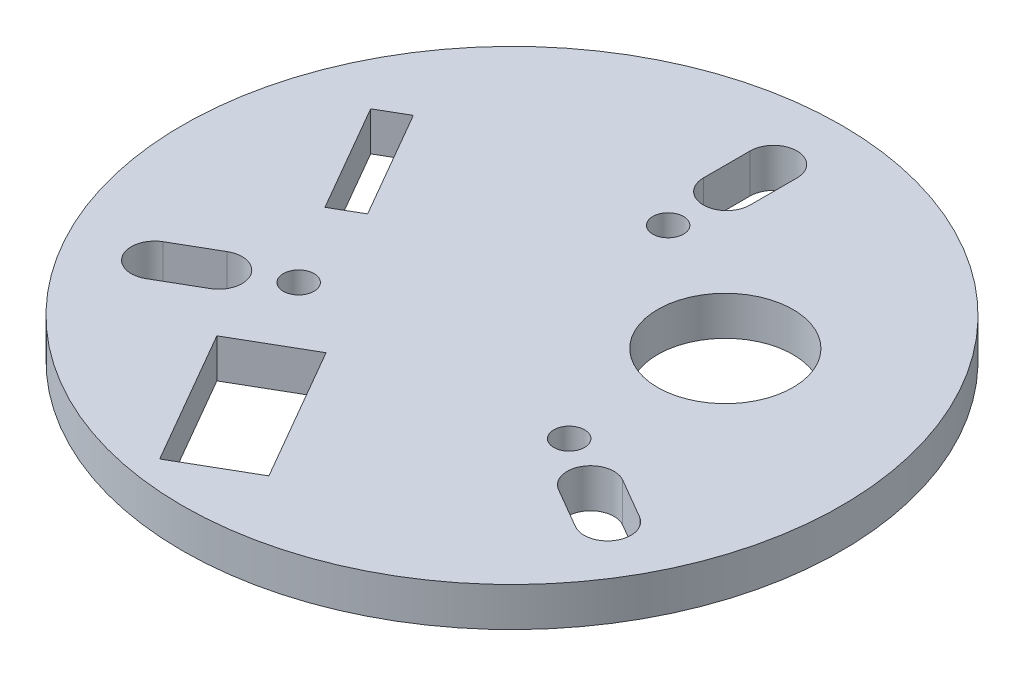
ISO-10303-21;
HEADER;
FILE_DESCRIPTION(('STEP AP214'),'2;1');
FILE_NAME('part.step','',(''),(''),'','','');
FILE_SCHEMA(('AUTOMOTIVE_DESIGN { 1 0 10303 214 1 1 1 1 }'));
ENDSEC;
DATA;
#1=APPLICATION_CONTEXT('core data for automotive mechanical design processes');
#2=APPLICATION_PROTOCOL_DEFINITION('international standard','automotive_design',2000,#1);
#3=PRODUCT_CONTEXT('',#1,'mechanical');
#4=PRODUCT('Part','Part','',(#3));
#5=PRODUCT_RELATED_PRODUCT_CATEGORY('part','',(#4));
#6=PRODUCT_DEFINITION_FORMATION('','',#4);
#7=PRODUCT_DEFINITION_CONTEXT('part definition',#1,'design');
#8=PRODUCT_DEFINITION('design','',#6,#7);
#9=PRODUCT_DEFINITION_SHAPE('','',#8);
#10=(LENGTH_UNIT() NAMED_UNIT(*) SI_UNIT(.MILLI.,.METRE.));
#11=(NAMED_UNIT(*) PLANE_ANGLE_UNIT() SI_UNIT($,.RADIAN.));
#12=(NAMED_UNIT(*) SI_UNIT($,.STERADIAN.) SOLID_ANGLE_UNIT());
#13=UNCERTAINTY_MEASURE_WITH_UNIT(LENGTH_MEASURE(1.E-05),#10,'distance_accuracy_value','');
#14=(GEOMETRIC_REPRESENTATION_CONTEXT(3) GLOBAL_UNCERTAINTY_ASSIGNED_CONTEXT((#13)) GLOBAL_UNIT_ASSIGNED_CONTEXT((#10,
#11,#12)) REPRESENTATION_CONTEXT('',''));
#15=CARTESIAN_POINT('',(0.,0.,0.));
#16=DIRECTION('',(0.,0.,1.));
#17=DIRECTION('',(1.,0.,0.));
#18=AXIS2_PLACEMENT_3D('',#15,#16,#17);
#19=CARTESIAN_POINT('',(0.,3.175,0.));
#20=DIRECTION('',(0.,1.,0.));
#21=DIRECTION('',(0.,0.,1.));
#22=AXIS2_PLACEMENT_3D('',#19,#20,#21);
#23=PLANE('',#22);
#24=DIRECTION('',(0.499999999999997,0.,0.86602540378444));
#25=VECTOR('',#24,1.);
#26=CARTESIAN_POINT('',(-15.2220670788775,3.175,-0.0103535768375322));
#27=LINE('',#26,#25);
#28=CARTESIAN_POINT('',(-20.3020670788775,3.175,-8.80917167928746));
#29=VERTEX_POINT('',#28);
#30=CARTESIAN_POINT('',(-15.2220670788775,3.175,-0.010353576837532));
#31=VERTEX_POINT('',#30);
#32=EDGE_CURVE('E51',#29,#31,#27,.T.);
#33=ORIENTED_EDGE('',*,*,#32,.F.);
#34=DIRECTION('',(-0.86602540378444,0.,0.499999999999997));
#35=VECTOR('',#34,1.);
#36=CARTESIAN_POINT('',(-20.3020670788775,3.175,-8.80917167928746));
#37=LINE('',#36,#35);
#38=CARTESIAN_POINT('',(-18.102362553265,3.175,-10.0791716792874));
#39=VERTEX_POINT('',#38);
#40=EDGE_CURVE('E191',#39,#29,#37,.T.);
#41=ORIENTED_EDGE('',*,*,#40,.F.);
#42=DIRECTION('',(-0.499999999999997,0.,-0.86602540378444));
#43=VECTOR('',#42,1.);
#44=CARTESIAN_POINT('',(-13.0223625532649,3.175,-1.28035357683724));
#45=LINE('',#44,#43);
#46=CARTESIAN_POINT('',(-13.0223625532649,3.175,-1.28035357683724));
#47=VERTEX_POINT('',#46);
#48=EDGE_CURVE('E176',#47,#39,#45,.T.);
#49=ORIENTED_EDGE('',*,*,#48,.F.);
#50=DIRECTION('',(0.866025403784505,0.,-0.499999999999885));
#51=VECTOR('',#50,1.);
#52=CARTESIAN_POINT('',(-15.2220670788775,3.175,-0.0103535768375322));
#53=LINE('',#52,#51);
#54=EDGE_CURVE('E185',#31,#47,#53,.T.);
#55=ORIENTED_EDGE('',*,*,#54,.F.);
#56=EDGE_LOOP('',(#33,#41,#49,#55));
#57=FACE_BOUND('',#56,.T.);
#58=DIRECTION('',(0.499999999999986,0.,0.866025403784447));
#59=VECTOR('',#58,1.);
#60=CARTESIAN_POINT('',(-4.21667541505758,3.175,24.4315439420934));
#61=LINE('',#60,#59);
#62=CARTESIAN_POINT('',(-10.5666754150574,3.175,13.4330213140309));
#63=VERTEX_POINT('',#62);
#64=CARTESIAN_POINT('',(-4.21667541505758,3.175,24.4315439420934));
#65=VERTEX_POINT('',#64);
#66=EDGE_CURVE('E198',#63,#65,#61,.T.);
#67=ORIENTED_EDGE('',*,*,#66,.F.);
#68=DIRECTION('',(-0.86602540378444,0.,0.499999999999997));
#69=VECTOR('',#68,1.);
#70=CARTESIAN_POINT('',(-10.5666754150574,3.175,13.4330213140309));
#71=LINE('',#70,#69);
#72=CARTESIAN_POINT('',(-4.93751029045854,3.175,10.1830213140309));
#73=VERTEX_POINT('',#72);
#74=EDGE_CURVE('E208',#73,#63,#71,.T.);
#75=ORIENTED_EDGE('',*,*,#74,.F.);
#76=DIRECTION('',(-0.499999999999998,0.,-0.86602540378444));
#77=VECTOR('',#76,1.);
#78=CARTESIAN_POINT('',(1.41248970954142,3.175,21.1815439420933));
#79=LINE('',#78,#77);
#80=CARTESIAN_POINT('',(1.41248970954142,3.175,21.1815439420933));
#81=VERTEX_POINT('',#80);
#82=EDGE_CURVE('E205',#81,#73,#79,.T.);
#83=ORIENTED_EDGE('',*,*,#82,.F.);
#84=DIRECTION('',(0.866025403784439,0.,-0.499999999999999));
#85=VECTOR('',#84,1.);
#86=CARTESIAN_POINT('',(-4.21667541505758,3.175,24.4315439420934));
#87=LINE('',#86,#85);
#88=EDGE_CURVE('E202',#65,#81,#87,.T.);
#89=ORIENTED_EDGE('',*,*,#88,.F.);
#90=EDGE_LOOP('',(#67,#75,#83,#89));
#91=FACE_BOUND('',#90,.T.);
#92=CARTESIAN_POINT('',(10.9985226280623,3.175,-6.35000000000005));
#93=DIRECTION('',(0.,1.,0.));
#94=DIRECTION('',(0.,0.,1.));
#95=AXIS2_PLACEMENT_3D('',#92,#93,#94);
#96=CIRCLE('',#95,5.5);
#97=CARTESIAN_POINT('',(10.9985226280623,3.175,-0.850000000000054));
#98=VERTEX_POINT('',#97);
#99=EDGE_CURVE('E214',#98,#98,#96,.T.);
#100=ORIENTED_EDGE('',*,*,#99,.F.);
#101=EDGE_LOOP('',(#100));
#102=FACE_BOUND('',#101,.T.);
#103=CARTESIAN_POINT('',(10.9985226280623,3.175,6.35000000000005));
#104=DIRECTION('',(0.,1.,0.));
#105=DIRECTION('',(0.,0.,1.));
#106=AXIS2_PLACEMENT_3D('',#103,#104,#105);
#107=CIRCLE('',#106,1.25);
#108=CARTESIAN_POINT('',(10.9985226280623,3.175,7.60000000000005));
#109=VERTEX_POINT('',#108);
#110=EDGE_CURVE('E228',#109,#109,#107,.T.);
#111=ORIENTED_EDGE('',*,*,#110,.F.);
#112=EDGE_LOOP('',(#111));
#113=FACE_BOUND('',#112,.T.);
#114=CARTESIAN_POINT('',(0.,3.175,-12.7));
#115=DIRECTION('',(0.,1.,0.));
#116=DIRECTION('',(0.,0.,1.));
#117=AXIS2_PLACEMENT_3D('',#114,#115,#116);
#118=CIRCLE('',#117,1.25);
#119=CARTESIAN_POINT('',(0.,3.175,-11.45));
#120=VERTEX_POINT('',#119);
#121=EDGE_CURVE('E227',#120,#120,#118,.T.);
#122=ORIENTED_EDGE('',*,*,#121,.F.);
#123=EDGE_LOOP('',(#122));
#124=FACE_BOUND('',#123,.T.);
#125=CARTESIAN_POINT('',(-10.9985226280624,3.175,6.3499999999999));
#126=DIRECTION('',(0.,1.,0.));
#127=DIRECTION('',(0.,0.,1.));
#128=AXIS2_PLACEMENT_3D('',#125,#126,#127);
#129=CIRCLE('',#128,1.25);
#130=CARTESIAN_POINT('',(-10.9985226280624,3.175,7.5999999999999));
#131=VERTEX_POINT('',#130);
#132=EDGE_CURVE('E234',#131,#131,#129,.T.);
#133=ORIENTED_EDGE('',*,*,#132,.F.);
#134=EDGE_LOOP('',(#133));
#135=FACE_BOUND('',#134,.T.);
#136=CARTESIAN_POINT('',(15.1230582521105,3.175,8.73128949130568));
#137=DIRECTION('',(0.,1.,0.));
#138=DIRECTION('',(0.,0.,1.));
#139=AXIS2_PLACEMENT_3D('',#136,#137,#138);
#140=CIRCLE('',#139,1.905);
#141=CARTESIAN_POINT('',(14.1650551040501,3.175,10.3778783799802));
#142=VERTEX_POINT('',#141);
#143=CARTESIAN_POINT('',(16.0810614001708,3.175,7.08470060263115));
#144=VERTEX_POINT('',#143);
#145=EDGE_CURVE('E289',#142,#144,#140,.F.);
#146=ORIENTED_EDGE('',*,*,#145,.T.);
#147=DIRECTION('',(0.864351122663791,0.,0.502888791632746));
#148=VECTOR('',#147,1.);
#149=CARTESIAN_POINT('',(0.987329920654388,3.175,-1.69699492125567));
#150=LINE('',#149,#148);
#151=CARTESIAN_POINT('',(19.3742391775199,3.175,9.00070689875192));
#152=VERTEX_POINT('',#151);
#153=EDGE_CURVE('E268',#144,#152,#150,.T.);
#154=ORIENTED_EDGE('',*,*,#153,.T.);
#155=CARTESIAN_POINT('',(18.4162360294595,3.175,10.6472957874264));
#156=DIRECTION('',(0.,1.,0.));
#157=DIRECTION('',(0.,0.,1.));
#158=AXIS2_PLACEMENT_3D('',#155,#156,#157);
#159=CIRCLE('',#158,1.905);
#160=CARTESIAN_POINT('',(17.4582328813991,3.175,12.293884676101));
#161=VERTEX_POINT('',#160);
#162=EDGE_CURVE('E278',#161,#152,#159,.T.);
#163=ORIENTED_EDGE('',*,*,#162,.F.);
#164=DIRECTION('',(0.864351122663792,0.,0.502888791632745));
#165=VECTOR('',#164,1.);
#166=CARTESIAN_POINT('',(-0.928676375466387,3.175,1.5961828560934));
#167=LINE('',#166,#165);
#168=EDGE_CURVE('E292',#142,#161,#167,.T.);
#169=ORIENTED_EDGE('',*,*,#168,.F.);
#170=EDGE_LOOP('',(#146,#154,#163,#169));
#171=FACE_BOUND('',#170,.T.);
#172=CARTESIAN_POINT('',(-4.99999999994862E-05,3.175,-21.2725));
#173=DIRECTION('',(0.,1.,0.));
#174=DIRECTION('',(0.,0.,1.));
#175=AXIS2_PLACEMENT_3D('',#172,#173,#174);
#176=CIRCLE('',#175,1.905);
#177=CARTESIAN_POINT('',(-1.90505,3.175,-21.2725));
#178=VERTEX_POINT('',#177);
#179=CARTESIAN_POINT('',(1.90495,3.175,-21.2725));
#180=VERTEX_POINT('',#179);
#181=EDGE_CURVE('E320',#178,#180,#176,.F.);
#182=ORIENTED_EDGE('',*,*,#181,.T.);
#183=DIRECTION('',(0.,0.,1.));
#184=VECTOR('',#183,1.);
#185=CARTESIAN_POINT('',(1.90495,3.175,0.));
#186=LINE('',#185,#184);
#187=CARTESIAN_POINT('',(1.90495,3.175,-17.4625));
#188=VERTEX_POINT('',#187);
#189=EDGE_CURVE('E299',#180,#188,#186,.T.);
#190=ORIENTED_EDGE('',*,*,#189,.T.);
#191=CARTESIAN_POINT('',(-4.99999999993778E-05,3.175,-17.4625));
#192=DIRECTION('',(0.,1.,0.));
#193=DIRECTION('',(0.,0.,1.));
#194=AXIS2_PLACEMENT_3D('',#191,#192,#193);
#195=CIRCLE('',#194,1.905);
#196=CARTESIAN_POINT('',(-1.90505,3.175,-17.4625));
#197=VERTEX_POINT('',#196);
#198=EDGE_CURVE('E309',#197,#188,#195,.T.);
#199=ORIENTED_EDGE('',*,*,#198,.F.);
#200=DIRECTION('',(0.,0.,1.));
#201=VECTOR('',#200,1.);
#202=CARTESIAN_POINT('',(-1.90505,3.175,0.));
#203=LINE('',#202,#201);
#204=EDGE_CURVE('E323',#178,#197,#203,.T.);
#205=ORIENTED_EDGE('',*,*,#204,.F.);
#206=EDGE_LOOP('',(#182,#190,#199,#205));
#207=FACE_BOUND('',#206,.T.);
#208=CARTESIAN_POINT('',(0.,3.175,0.));
#209=DIRECTION('',(0.,1.,0.));
#210=DIRECTION('',(0.,0.,1.));
#211=AXIS2_PLACEMENT_3D('',#208,#209,#210);
#212=CIRCLE('',#211,26.799999994);
#213=CARTESIAN_POINT('',(0.,3.175,26.799999994));
#214=VERTEX_POINT('',#213);
#215=EDGE_CURVE('E337',#214,#214,#212,.T.);
#216=ORIENTED_EDGE('',*,*,#215,.T.);
#217=EDGE_LOOP('',(#216));
#218=FACE_BOUND('',#217,.T.);
#219=CARTESIAN_POINT('',(-15.1229051135858,3.175,8.73135998522614));
#220=DIRECTION('',(0.,1.,0.));
#221=DIRECTION('',(0.,0.,1.));
#222=AXIS2_PLACEMENT_3D('',#219,#220,#221);
#223=CIRCLE('',#222,1.905);
#224=CARTESIAN_POINT('',(-14.1704051135859,3.175,10.3811383794355));
#225=VERTEX_POINT('',#224);
#226=CARTESIAN_POINT('',(-16.0754051135858,3.175,7.08158159101678));
#227=VERTEX_POINT('',#226);
#228=EDGE_CURVE('E258',#225,#227,#223,.T.);
#229=ORIENTED_EDGE('',*,*,#228,.F.);
#230=DIRECTION('',(-0.866025403784443,0.,0.499999999999992));
#231=VECTOR('',#230,1.);
#232=CARTESIAN_POINT('',(0.952563499999987,3.175,1.64988837943565));
#233=LINE('',#232,#231);
#234=CARTESIAN_POINT('',(-17.4699619020046,3.175,12.2861383794355));
#235=VERTEX_POINT('',#234);
#236=EDGE_CURVE('E240',#225,#235,#233,.T.);
#237=ORIENTED_EDGE('',*,*,#236,.T.);
#238=CARTESIAN_POINT('',(-18.4224619020046,3.175,10.6363599852261));
#239=DIRECTION('',(0.,1.,0.));
#240=DIRECTION('',(0.,0.,1.));
#241=AXIS2_PLACEMENT_3D('',#238,#239,#240);
#242=CIRCLE('',#241,1.905);
#243=CARTESIAN_POINT('',(-19.3749619020046,3.175,8.98658159101675));
#244=VERTEX_POINT('',#243);
#245=EDGE_CURVE('E246',#244,#235,#242,.T.);
#246=ORIENTED_EDGE('',*,*,#245,.F.);
#247=DIRECTION('',(-0.866025403784443,0.,0.499999999999992));
#248=VECTOR('',#247,1.);
#249=CARTESIAN_POINT('',(-0.952436499999989,3.175,-1.64966840898309));
#250=LINE('',#249,#248);
#251=EDGE_CURVE('E261',#227,#244,#250,.T.);
#252=ORIENTED_EDGE('',*,*,#251,.F.);
#253=EDGE_LOOP('',(#229,#237,#246,#252));
#254=FACE_BOUND('',#253,.T.);
#255=ADVANCED_FACE('F36',(#57,#91,#102,#113,#124,#135,#171,#207,#218,#254),#23,.T.);
#256=CARTESIAN_POINT('',(0.,0.,0.));
#257=DIRECTION('',(0.,1.,0.));
#258=DIRECTION('',(0.,0.,1.));
#259=AXIS2_PLACEMENT_3D('',#256,#257,#258);
#260=PLANE('',#259);
#261=DIRECTION('',(-0.866025403784441,0.,0.499999999999997));
#262=VECTOR('',#261,1.);
#263=CARTESIAN_POINT('',(-8.88999999999998,0.,-15.3979316792874));
#264=LINE('',#263,#262);
#265=CARTESIAN_POINT('',(-18.102362553265,0.,-10.0791716792874));
#266=VERTEX_POINT('',#265);
#267=CARTESIAN_POINT('',(-20.3020670788775,0.,-8.80917167928746));
#268=VERTEX_POINT('',#267);
#269=EDGE_CURVE('E44',#266,#268,#264,.T.);
#270=ORIENTED_EDGE('',*,*,#269,.T.);
#271=DIRECTION('',(0.499999999999997,0.,0.86602540378444));
#272=VECTOR('',#271,1.);
#273=CARTESIAN_POINT('',(-11.4120670788775,0.,6.58875999999995));
#274=LINE('',#273,#272);
#275=CARTESIAN_POINT('',(-15.2220670788775,0.,-0.0103535768375322));
#276=VERTEX_POINT('',#275);
#277=EDGE_CURVE('E11',#268,#276,#274,.T.);
#278=ORIENTED_EDGE('',*,*,#277,.T.);
#279=DIRECTION('',(0.866025403784505,0.,-0.499999999999885));
#280=VECTOR('',#279,1.);
#281=CARTESIAN_POINT('',(-3.8099999999983,0.,-6.5991135768365));
#282=LINE('',#281,#280);
#283=CARTESIAN_POINT('',(-13.0223625532649,0.,-1.28035357683724));
#284=VERTEX_POINT('',#283);
#285=EDGE_CURVE('E356',#276,#284,#282,.T.);
#286=ORIENTED_EDGE('',*,*,#285,.T.);
#287=DIRECTION('',(-0.499999999999997,0.,-0.866025403784441));
#288=VECTOR('',#287,1.);
#289=CARTESIAN_POINT('',(-9.21236255326506,0.,5.31875999999996));
#290=LINE('',#289,#288);
#291=EDGE_CURVE('E179',#284,#266,#290,.T.);
#292=ORIENTED_EDGE('',*,*,#291,.T.);
#293=EDGE_LOOP('',(#270,#278,#286,#292));
#294=FACE_BOUND('',#293,.T.);
#295=DIRECTION('',(-0.86602540378444,0.,0.499999999999997));
#296=VECTOR('',#295,1.);
#297=CARTESIAN_POINT('',(3.17499999999994,0.,5.49926131403112));
#298=LINE('',#297,#296);
#299=CARTESIAN_POINT('',(-4.93751029045854,0.,10.1830213140309));
#300=VERTEX_POINT('',#299);
#301=CARTESIAN_POINT('',(-10.5666754150574,0.,13.4330213140309));
#302=VERTEX_POINT('',#301);
#303=EDGE_CURVE('E350',#300,#302,#298,.T.);
#304=ORIENTED_EDGE('',*,*,#303,.T.);
#305=DIRECTION('',(0.499999999999986,0.,0.866025403784447));
#306=VECTOR('',#305,1.);
#307=CARTESIAN_POINT('',(-13.7416754150574,0.,7.93375999999954));
#308=LINE('',#307,#306);
#309=CARTESIAN_POINT('',(-4.21667541505758,0.,24.4315439420934));
#310=VERTEX_POINT('',#309);
#311=EDGE_CURVE('E353',#302,#310,#308,.T.);
#312=ORIENTED_EDGE('',*,*,#311,.T.);
#313=DIRECTION('',(0.866025403784439,0.,-0.499999999999999));
#314=VECTOR('',#313,1.);
#315=CARTESIAN_POINT('',(9.52499999999993,0.,16.4977839420935));
#316=LINE('',#315,#314);
#317=CARTESIAN_POINT('',(1.41248970954142,0.,21.1815439420933));
#318=VERTEX_POINT('',#317);
#319=EDGE_CURVE('E340',#310,#318,#316,.T.);
#320=ORIENTED_EDGE('',*,*,#319,.T.);
#321=DIRECTION('',(-0.499999999999998,0.,-0.86602540378444));
#322=VECTOR('',#321,1.);
#323=CARTESIAN_POINT('',(-8.11251029045849,0.,4.68375999999979));
#324=LINE('',#323,#322);
#325=EDGE_CURVE('E347',#318,#300,#324,.T.);
#326=ORIENTED_EDGE('',*,*,#325,.T.);
#327=EDGE_LOOP('',(#304,#312,#320,#326));
#328=FACE_BOUND('',#327,.T.);
#329=CARTESIAN_POINT('',(10.9985226280623,0.,-6.35000000000005));
#330=DIRECTION('',(0.,1.,0.));
#331=DIRECTION('',(0.,0.,1.));
#332=AXIS2_PLACEMENT_3D('',#329,#330,#331);
#333=CIRCLE('',#332,5.5);
#334=CARTESIAN_POINT('',(10.9985226280623,0.,-0.850000000000054));
#335=VERTEX_POINT('',#334);
#336=EDGE_CURVE('E223',#335,#335,#333,.T.);
#337=ORIENTED_EDGE('',*,*,#336,.T.);
#338=EDGE_LOOP('',(#337));
#339=FACE_BOUND('',#338,.T.);
#340=CARTESIAN_POINT('',(10.9985226280623,0.,6.35000000000005));
#341=DIRECTION('',(0.,1.,0.));
#342=DIRECTION('',(0.,0.,1.));
#343=AXIS2_PLACEMENT_3D('',#340,#341,#342);
#344=CIRCLE('',#343,1.25);
#345=CARTESIAN_POINT('',(10.9985226280623,0.,7.60000000000005));
#346=VERTEX_POINT('',#345);
#347=EDGE_CURVE('E224',#346,#346,#344,.T.);
#348=ORIENTED_EDGE('',*,*,#347,.T.);
#349=EDGE_LOOP('',(#348));
#350=FACE_BOUND('',#349,.T.);
#351=CARTESIAN_POINT('',(0.,0.,-12.7));
#352=DIRECTION('',(0.,1.,0.));
#353=DIRECTION('',(0.,0.,1.));
#354=AXIS2_PLACEMENT_3D('',#351,#352,#353);
#355=CIRCLE('',#354,1.25);
#356=CARTESIAN_POINT('',(0.,0.,-11.45));
#357=VERTEX_POINT('',#356);
#358=EDGE_CURVE('E231',#357,#357,#355,.T.);
#359=ORIENTED_EDGE('',*,*,#358,.T.);
#360=EDGE_LOOP('',(#359));
#361=FACE_BOUND('',#360,.T.);
#362=CARTESIAN_POINT('',(-10.9985226280624,0.,6.3499999999999));
#363=DIRECTION('',(0.,1.,0.));
#364=DIRECTION('',(0.,0.,1.));
#365=AXIS2_PLACEMENT_3D('',#362,#363,#364);
#366=CIRCLE('',#365,1.25);
#367=CARTESIAN_POINT('',(-10.9985226280624,0.,7.5999999999999));
#368=VERTEX_POINT('',#367);
#369=EDGE_CURVE('E237',#368,#368,#366,.T.);
#370=ORIENTED_EDGE('',*,*,#369,.T.);
#371=EDGE_LOOP('',(#370));
#372=FACE_BOUND('',#371,.T.);
#373=CARTESIAN_POINT('',(0.,0.,0.));
#374=DIRECTION('',(0.,1.,0.));
#375=DIRECTION('',(0.,0.,1.));
#376=AXIS2_PLACEMENT_3D('',#373,#374,#375);
#377=CIRCLE('',#376,26.799999994);
#378=CARTESIAN_POINT('',(0.,0.,26.799999994));
#379=VERTEX_POINT('',#378);
#380=EDGE_CURVE('E330',#379,#379,#377,.T.);
#381=ORIENTED_EDGE('',*,*,#380,.F.);
#382=EDGE_LOOP('',(#381));
#383=FACE_BOUND('',#382,.T.);
#384=DIRECTION('',(0.,0.,1.));
#385=VECTOR('',#384,1.);
#386=CARTESIAN_POINT('',(1.90495,0.,0.));
#387=LINE('',#386,#385);
#388=CARTESIAN_POINT('',(1.90495,0.,-21.2725));
#389=VERTEX_POINT('',#388);
#390=CARTESIAN_POINT('',(1.90495,0.,-17.4625));
#391=VERTEX_POINT('',#390);
#392=EDGE_CURVE('E306',#389,#391,#387,.T.);
#393=ORIENTED_EDGE('',*,*,#392,.F.);
#394=CARTESIAN_POINT('',(-4.99999999994862E-05,0.,-21.2725));
#395=DIRECTION('',(0.,1.,0.));
#396=DIRECTION('',(0.,0.,1.));
#397=AXIS2_PLACEMENT_3D('',#394,#395,#396);
#398=CIRCLE('',#397,1.905);
#399=CARTESIAN_POINT('',(-1.90505,0.,-21.2725));
#400=VERTEX_POINT('',#399);
#401=EDGE_CURVE('E308',#400,#389,#398,.F.);
#402=ORIENTED_EDGE('',*,*,#401,.F.);
#403=DIRECTION('',(0.,0.,1.));
#404=VECTOR('',#403,1.);
#405=CARTESIAN_POINT('',(-1.90505,0.,0.));
#406=LINE('',#405,#404);
#407=CARTESIAN_POINT('',(-1.90505,0.,-17.4625));
#408=VERTEX_POINT('',#407);
#409=EDGE_CURVE('E311',#400,#408,#406,.T.);
#410=ORIENTED_EDGE('',*,*,#409,.T.);
#411=CARTESIAN_POINT('',(-4.99999999993778E-05,0.,-17.4625));
#412=DIRECTION('',(0.,1.,0.));
#413=DIRECTION('',(0.,0.,1.));
#414=AXIS2_PLACEMENT_3D('',#411,#412,#413);
#415=CIRCLE('',#414,1.905);
#416=EDGE_CURVE('E314',#408,#391,#415,.T.);
#417=ORIENTED_EDGE('',*,*,#416,.T.);
#418=EDGE_LOOP('',(#393,#402,#410,#417));
#419=FACE_BOUND('',#418,.T.);
#420=DIRECTION('',(0.864351122663791,0.,0.502888791632746));
#421=VECTOR('',#420,1.);
#422=CARTESIAN_POINT('',(0.987329920654388,0.,-1.69699492125567));
#423=LINE('',#422,#421);
#424=CARTESIAN_POINT('',(16.0810614001708,0.,7.08470060263116));
#425=VERTEX_POINT('',#424);
#426=CARTESIAN_POINT('',(19.3742391775199,0.,9.00070689875192));
#427=VERTEX_POINT('',#426);
#428=EDGE_CURVE('E275',#425,#427,#423,.T.);
#429=ORIENTED_EDGE('',*,*,#428,.F.);
#430=CARTESIAN_POINT('',(15.1230582521105,0.,8.73128949130568));
#431=DIRECTION('',(0.,1.,0.));
#432=DIRECTION('',(0.,0.,1.));
#433=AXIS2_PLACEMENT_3D('',#430,#431,#432);
#434=CIRCLE('',#433,1.905);
#435=CARTESIAN_POINT('',(14.1650551040501,0.,10.3778783799802));
#436=VERTEX_POINT('',#435);
#437=EDGE_CURVE('E277',#436,#425,#434,.F.);
#438=ORIENTED_EDGE('',*,*,#437,.F.);
#439=DIRECTION('',(0.864351122663792,0.,0.502888791632745));
#440=VECTOR('',#439,1.);
#441=CARTESIAN_POINT('',(-0.928676375466387,0.,1.5961828560934));
#442=LINE('',#441,#440);
#443=CARTESIAN_POINT('',(17.4582328813991,0.,12.293884676101));
#444=VERTEX_POINT('',#443);
#445=EDGE_CURVE('E280',#436,#444,#442,.T.);
#446=ORIENTED_EDGE('',*,*,#445,.T.);
#447=CARTESIAN_POINT('',(18.4162360294595,0.,10.6472957874264));
#448=DIRECTION('',(0.,1.,0.));
#449=DIRECTION('',(0.,0.,1.));
#450=AXIS2_PLACEMENT_3D('',#447,#448,#449);
#451=CIRCLE('',#450,1.905);
#452=EDGE_CURVE('E283',#444,#427,#451,.T.);
#453=ORIENTED_EDGE('',*,*,#452,.T.);
#454=EDGE_LOOP('',(#429,#438,#446,#453));
#455=FACE_BOUND('',#454,.T.);
#456=DIRECTION('',(-0.866025403784443,0.,0.499999999999992));
#457=VECTOR('',#456,1.);
#458=CARTESIAN_POINT('',(0.952563499999987,0.,1.64988837943565));
#459=LINE('',#458,#457);
#460=CARTESIAN_POINT('',(-14.1704051135859,0.,10.3811383794355));
#461=VERTEX_POINT('',#460);
#462=CARTESIAN_POINT('',(-17.4699619020046,0.,12.2861383794355));
#463=VERTEX_POINT('',#462);
#464=EDGE_CURVE('E243',#461,#463,#459,.T.);
#465=ORIENTED_EDGE('',*,*,#464,.F.);
#466=CARTESIAN_POINT('',(-15.1229051135858,0.,8.73135998522614));
#467=DIRECTION('',(0.,1.,0.));
#468=DIRECTION('',(0.,0.,1.));
#469=AXIS2_PLACEMENT_3D('',#466,#467,#468);
#470=CIRCLE('',#469,1.905);
#471=CARTESIAN_POINT('',(-16.0754051135858,0.,7.08158159101677));
#472=VERTEX_POINT('',#471);
#473=EDGE_CURVE('E245',#461,#472,#470,.T.);
#474=ORIENTED_EDGE('',*,*,#473,.T.);
#475=DIRECTION('',(-0.866025403784443,0.,0.499999999999992));
#476=VECTOR('',#475,1.);
#477=CARTESIAN_POINT('',(-0.952436499999989,0.,-1.64966840898309));
#478=LINE('',#477,#476);
#479=CARTESIAN_POINT('',(-19.3749619020046,0.,8.98658159101675));
#480=VERTEX_POINT('',#479);
#481=EDGE_CURVE('E249',#472,#480,#478,.T.);
#482=ORIENTED_EDGE('',*,*,#481,.T.);
#483=CARTESIAN_POINT('',(-18.4224619020046,0.,10.6363599852261));
#484=DIRECTION('',(0.,1.,0.));
#485=DIRECTION('',(0.,0.,1.));
#486=AXIS2_PLACEMENT_3D('',#483,#484,#485);
#487=CIRCLE('',#486,1.905);
#488=EDGE_CURVE('E252',#480,#463,#487,.T.);
#489=ORIENTED_EDGE('',*,*,#488,.T.);
#490=EDGE_LOOP('',(#465,#474,#482,#489));
#491=FACE_BOUND('',#490,.T.);
#492=ADVANCED_FACE('F360',(#294,#328,#339,#350,#361,#372,#383,#419,#455,#491),#260,.F.);
#493=CARTESIAN_POINT('',(0.,3.175,0.));
#494=DIRECTION('',(0.,-1.,0.));
#495=DIRECTION('',(0.,0.,-1.));
#496=AXIS2_PLACEMENT_3D('',#493,#494,#495);
#497=CYLINDRICAL_SURFACE('',#496,26.799999994);
#498=ORIENTED_EDGE('',*,*,#215,.F.);
#499=EDGE_LOOP('',(#498));
#500=FACE_BOUND('',#499,.T.);
#501=ORIENTED_EDGE('',*,*,#380,.T.);
#502=EDGE_LOOP('',(#501));
#503=FACE_BOUND('',#502,.T.);
#504=ADVANCED_FACE('F38',(#500,#503),#497,.T.);
#505=CARTESIAN_POINT('',(1.90495,0.,0.));
#506=DIRECTION('',(-1.,0.,0.));
#507=DIRECTION('',(0.,0.,1.));
#508=AXIS2_PLACEMENT_3D('',#505,#506,#507);
#509=PLANE('',#508);
#510=ORIENTED_EDGE('',*,*,#189,.F.);
#511=DIRECTION('',(0.,1.,0.));
#512=VECTOR('',#511,1.);
#513=CARTESIAN_POINT('',(1.90495,0.,-21.2725));
#514=LINE('',#513,#512);
#515=EDGE_CURVE('E317',#389,#180,#514,.T.);
#516=ORIENTED_EDGE('',*,*,#515,.F.);
#517=ORIENTED_EDGE('',*,*,#392,.T.);
#518=DIRECTION('',(0.,1.,0.));
#519=VECTOR('',#518,1.);
#520=CARTESIAN_POINT('',(1.90495,0.,-17.4625));
#521=LINE('',#520,#519);
#522=EDGE_CURVE('E328',#391,#188,#521,.T.);
#523=ORIENTED_EDGE('',*,*,#522,.T.);
#524=EDGE_LOOP('',(#510,#516,#517,#523));
#525=FACE_BOUND('',#524,.T.);
#526=ADVANCED_FACE('F385',(#525),#509,.T.);
#527=CARTESIAN_POINT('',(-4.99999999993778E-05,0.,-17.4625));
#528=DIRECTION('',(0.,1.,0.));
#529=DIRECTION('',(0.,0.,1.));
#530=AXIS2_PLACEMENT_3D('',#527,#528,#529);
#531=CYLINDRICAL_SURFACE('',#530,1.905);
#532=ORIENTED_EDGE('',*,*,#198,.T.);
#533=ORIENTED_EDGE('',*,*,#522,.F.);
#534=ORIENTED_EDGE('',*,*,#416,.F.);
#535=DIRECTION('',(0.,1.,0.));
#536=VECTOR('',#535,1.);
#537=CARTESIAN_POINT('',(-1.90505,0.,-17.4625));
#538=LINE('',#537,#536);
#539=EDGE_CURVE('E331',#408,#197,#538,.T.);
#540=ORIENTED_EDGE('',*,*,#539,.T.);
#541=EDGE_LOOP('',(#532,#533,#534,#540));
#542=FACE_BOUND('',#541,.T.);
#543=ADVANCED_FACE('F388',(#542),#531,.F.);
#544=CARTESIAN_POINT('',(-1.90505,0.,0.));
#545=DIRECTION('',(-1.,0.,0.));
#546=DIRECTION('',(0.,0.,1.));
#547=AXIS2_PLACEMENT_3D('',#544,#545,#546);
#548=PLANE('',#547);
#549=ORIENTED_EDGE('',*,*,#204,.T.);
#550=ORIENTED_EDGE('',*,*,#539,.F.);
#551=ORIENTED_EDGE('',*,*,#409,.F.);
#552=DIRECTION('',(0.,1.,0.));
#553=VECTOR('',#552,1.);
#554=CARTESIAN_POINT('',(-1.90505,0.,-21.2725));
#555=LINE('',#554,#553);
#556=EDGE_CURVE('E333',#400,#178,#555,.T.);
#557=ORIENTED_EDGE('',*,*,#556,.T.);
#558=EDGE_LOOP('',(#549,#550,#551,#557));
#559=FACE_BOUND('',#558,.T.);
#560=ADVANCED_FACE('F394',(#559),#548,.F.);
#561=CARTESIAN_POINT('',(-4.99999999994862E-05,0.,-21.2725));
#562=DIRECTION('',(0.,1.,0.));
#563=DIRECTION('',(0.,0.,1.));
#564=AXIS2_PLACEMENT_3D('',#561,#562,#563);
#565=CYLINDRICAL_SURFACE('',#564,1.905);
#566=ORIENTED_EDGE('',*,*,#181,.F.);
#567=ORIENTED_EDGE('',*,*,#556,.F.);
#568=ORIENTED_EDGE('',*,*,#401,.T.);
#569=ORIENTED_EDGE('',*,*,#515,.T.);
#570=EDGE_LOOP('',(#566,#567,#568,#569));
#571=FACE_BOUND('',#570,.T.);
#572=ADVANCED_FACE('F390',(#571),#565,.F.);
#573=CARTESIAN_POINT('',(0.987329920654388,0.,-1.69699492125567));
#574=DIRECTION('',(-0.502888791632746,0.,0.864351122663791));
#575=DIRECTION('',(0.864351122663792,0.,0.502888791632746));
#576=AXIS2_PLACEMENT_3D('',#573,#574,#575);
#577=PLANE('',#576);
#578=ORIENTED_EDGE('',*,*,#153,.F.);
#579=DIRECTION('',(0.,1.,0.));
#580=VECTOR('',#579,1.);
#581=CARTESIAN_POINT('',(16.0810614001708,0.,7.08470060263116));
#582=LINE('',#581,#580);
#583=EDGE_CURVE('E286',#425,#144,#582,.T.);
#584=ORIENTED_EDGE('',*,*,#583,.F.);
#585=ORIENTED_EDGE('',*,*,#428,.T.);
#586=DIRECTION('',(0.,1.,0.));
#587=VECTOR('',#586,1.);
#588=CARTESIAN_POINT('',(19.3742391775199,0.,9.00070689875192));
#589=LINE('',#588,#587);
#590=EDGE_CURVE('E297',#427,#152,#589,.T.);
#591=ORIENTED_EDGE('',*,*,#590,.T.);
#592=EDGE_LOOP('',(#578,#584,#585,#591));
#593=FACE_BOUND('',#592,.T.);
#594=ADVANCED_FACE('F393',(#593),#577,.T.);
#595=CARTESIAN_POINT('',(18.4162360294595,0.,10.6472957874264));
#596=DIRECTION('',(0.,1.,0.));
#597=DIRECTION('',(0.,0.,1.));
#598=AXIS2_PLACEMENT_3D('',#595,#596,#597);
#599=CYLINDRICAL_SURFACE('',#598,1.905);
#600=ORIENTED_EDGE('',*,*,#162,.T.);
#601=ORIENTED_EDGE('',*,*,#590,.F.);
#602=ORIENTED_EDGE('',*,*,#452,.F.);
#603=DIRECTION('',(0.,1.,0.));
#604=VECTOR('',#603,1.);
#605=CARTESIAN_POINT('',(17.4582328813991,0.,12.293884676101));
#606=LINE('',#605,#604);
#607=EDGE_CURVE('E300',#444,#161,#606,.T.);
#608=ORIENTED_EDGE('',*,*,#607,.T.);
#609=EDGE_LOOP('',(#600,#601,#602,#608));
#610=FACE_BOUND('',#609,.T.);
#611=ADVANCED_FACE('F404',(#610),#599,.F.);
#612=CARTESIAN_POINT('',(-0.928676375466387,0.,1.5961828560934));
#613=DIRECTION('',(-0.502888791632745,0.,0.864351122663792));
#614=DIRECTION('',(0.864351122663792,0.,0.502888791632745));
#615=AXIS2_PLACEMENT_3D('',#612,#613,#614);
#616=PLANE('',#615);
#617=ORIENTED_EDGE('',*,*,#168,.T.);
#618=ORIENTED_EDGE('',*,*,#607,.F.);
#619=ORIENTED_EDGE('',*,*,#445,.F.);
#620=DIRECTION('',(0.,1.,0.));
#621=VECTOR('',#620,1.);
#622=CARTESIAN_POINT('',(14.1650551040501,0.,10.3778783799802));
#623=LINE('',#622,#621);
#624=EDGE_CURVE('E302',#436,#142,#623,.T.);
#625=ORIENTED_EDGE('',*,*,#624,.T.);
#626=EDGE_LOOP('',(#617,#618,#619,#625));
#627=FACE_BOUND('',#626,.T.);
#628=ADVANCED_FACE('F410',(#627),#616,.F.);
#629=CARTESIAN_POINT('',(15.1230582521105,0.,8.73128949130568));
#630=DIRECTION('',(0.,1.,0.));
#631=DIRECTION('',(0.,0.,1.));
#632=AXIS2_PLACEMENT_3D('',#629,#630,#631);
#633=CYLINDRICAL_SURFACE('',#632,1.905);
#634=ORIENTED_EDGE('',*,*,#145,.F.);
#635=ORIENTED_EDGE('',*,*,#624,.F.);
#636=ORIENTED_EDGE('',*,*,#437,.T.);
#637=ORIENTED_EDGE('',*,*,#583,.T.);
#638=EDGE_LOOP('',(#634,#635,#636,#637));
#639=FACE_BOUND('',#638,.T.);
#640=ADVANCED_FACE('F406',(#639),#633,.F.);
#641=CARTESIAN_POINT('',(0.952563499999987,0.,1.64988837943565));
#642=DIRECTION('',(-0.499999999999992,0.,-0.866025403784443));
#643=DIRECTION('',(-0.866025403784443,0.,0.499999999999992));
#644=AXIS2_PLACEMENT_3D('',#641,#642,#643);
#645=PLANE('',#644);
#646=ORIENTED_EDGE('',*,*,#236,.F.);
#647=DIRECTION('',(0.,1.,0.));
#648=VECTOR('',#647,1.);
#649=CARTESIAN_POINT('',(-14.1704051135859,0.,10.3811383794355));
#650=LINE('',#649,#648);
#651=EDGE_CURVE('E255',#461,#225,#650,.T.);
#652=ORIENTED_EDGE('',*,*,#651,.F.);
#653=ORIENTED_EDGE('',*,*,#464,.T.);
#654=DIRECTION('',(0.,1.,0.));
#655=VECTOR('',#654,1.);
#656=CARTESIAN_POINT('',(-17.4699619020046,0.,12.2861383794355));
#657=LINE('',#656,#655);
#658=EDGE_CURVE('E266',#463,#235,#657,.T.);
#659=ORIENTED_EDGE('',*,*,#658,.T.);
#660=EDGE_LOOP('',(#646,#652,#653,#659));
#661=FACE_BOUND('',#660,.T.);
#662=ADVANCED_FACE('F409',(#661),#645,.T.);
#663=CARTESIAN_POINT('',(-18.4224619020046,0.,10.6363599852261));
#664=DIRECTION('',(0.,1.,0.));
#665=DIRECTION('',(0.,0.,1.));
#666=AXIS2_PLACEMENT_3D('',#663,#664,#665);
#667=CYLINDRICAL_SURFACE('',#666,1.905);
#668=ORIENTED_EDGE('',*,*,#245,.T.);
#669=ORIENTED_EDGE('',*,*,#658,.F.);
#670=ORIENTED_EDGE('',*,*,#488,.F.);
#671=DIRECTION('',(0.,1.,0.));
#672=VECTOR('',#671,1.);
#673=CARTESIAN_POINT('',(-19.3749619020046,0.,8.98658159101675));
#674=LINE('',#673,#672);
#675=EDGE_CURVE('E269',#480,#244,#674,.T.);
#676=ORIENTED_EDGE('',*,*,#675,.T.);
#677=EDGE_LOOP('',(#668,#669,#670,#676));
#678=FACE_BOUND('',#677,.T.);
#679=ADVANCED_FACE('F420',(#678),#667,.F.);
#680=CARTESIAN_POINT('',(-0.952436499999989,0.,-1.64966840898309));
#681=DIRECTION('',(-0.499999999999992,0.,-0.866025403784443));
#682=DIRECTION('',(-0.866025403784443,0.,0.499999999999992));
#683=AXIS2_PLACEMENT_3D('',#680,#681,#682);
#684=PLANE('',#683);
#685=ORIENTED_EDGE('',*,*,#251,.T.);
#686=ORIENTED_EDGE('',*,*,#675,.F.);
#687=ORIENTED_EDGE('',*,*,#481,.F.);
#688=DIRECTION('',(0.,1.,0.));
#689=VECTOR('',#688,1.);
#690=CARTESIAN_POINT('',(-16.0754051135858,0.,7.08158159101678));
#691=LINE('',#690,#689);
#692=EDGE_CURVE('E271',#472,#227,#691,.T.);
#693=ORIENTED_EDGE('',*,*,#692,.T.);
#694=EDGE_LOOP('',(#685,#686,#687,#693));
#695=FACE_BOUND('',#694,.T.);
#696=ADVANCED_FACE('F426',(#695),#684,.F.);
#697=CARTESIAN_POINT('',(-15.1229051135858,0.,8.73135998522614));
#698=DIRECTION('',(0.,1.,0.));
#699=DIRECTION('',(0.,0.,1.));
#700=AXIS2_PLACEMENT_3D('',#697,#698,#699);
#701=CYLINDRICAL_SURFACE('',#700,1.905);
#702=ORIENTED_EDGE('',*,*,#228,.T.);
#703=ORIENTED_EDGE('',*,*,#692,.F.);
#704=ORIENTED_EDGE('',*,*,#473,.F.);
#705=ORIENTED_EDGE('',*,*,#651,.T.);
#706=EDGE_LOOP('',(#702,#703,#704,#705));
#707=FACE_BOUND('',#706,.T.);
#708=ADVANCED_FACE('F422',(#707),#701,.F.);
#709=CARTESIAN_POINT('',(-10.9985226280624,0.,6.3499999999999));
#710=DIRECTION('',(0.,1.,0.));
#711=DIRECTION('',(0.,0.,1.));
#712=AXIS2_PLACEMENT_3D('',#709,#710,#711);
#713=CYLINDRICAL_SURFACE('',#712,1.25);
#714=ORIENTED_EDGE('',*,*,#369,.F.);
#715=EDGE_LOOP('',(#714));
#716=FACE_BOUND('',#715,.T.);
#717=ORIENTED_EDGE('',*,*,#132,.T.);
#718=EDGE_LOOP('',(#717));
#719=FACE_BOUND('',#718,.T.);
#720=ADVANCED_FACE('F425',(#716,#719),#713,.F.);
#721=CARTESIAN_POINT('',(0.,0.,-12.7));
#722=DIRECTION('',(0.,1.,0.));
#723=DIRECTION('',(0.,0.,1.));
#724=AXIS2_PLACEMENT_3D('',#721,#722,#723);
#725=CYLINDRICAL_SURFACE('',#724,1.25);
#726=ORIENTED_EDGE('',*,*,#358,.F.);
#727=EDGE_LOOP('',(#726));
#728=FACE_BOUND('',#727,.T.);
#729=ORIENTED_EDGE('',*,*,#121,.T.);
#730=EDGE_LOOP('',(#729));
#731=FACE_BOUND('',#730,.T.);
#732=ADVANCED_FACE('F436',(#728,#731),#725,.F.);
#733=CARTESIAN_POINT('',(10.9985226280623,0.,6.35000000000005));
#734=DIRECTION('',(0.,1.,0.));
#735=DIRECTION('',(0.,0.,1.));
#736=AXIS2_PLACEMENT_3D('',#733,#734,#735);
#737=CYLINDRICAL_SURFACE('',#736,1.25);
#738=ORIENTED_EDGE('',*,*,#347,.F.);
#739=EDGE_LOOP('',(#738));
#740=FACE_BOUND('',#739,.T.);
#741=ORIENTED_EDGE('',*,*,#110,.T.);
#742=EDGE_LOOP('',(#741));
#743=FACE_BOUND('',#742,.T.);
#744=ADVANCED_FACE('F440',(#740,#743),#737,.F.);
#745=CARTESIAN_POINT('',(10.9985226280623,-4.445,-6.35000000000005));
#746=DIRECTION('',(0.,1.,0.));
#747=DIRECTION('',(0.,0.,1.));
#748=AXIS2_PLACEMENT_3D('',#745,#746,#747);
#749=CYLINDRICAL_SURFACE('',#748,5.5);
#750=CARTESIAN_POINT('',(10.9985226280623,3.175,-0.850000000000054));
#751=CARTESIAN_POINT('',(10.9985226280623,3.14192708333333,-0.850000000000054));
#752=CARTESIAN_POINT('',(10.9985226280623,3.10885416666667,-0.850000000000054));
#753=CARTESIAN_POINT('',(10.9985226280623,3.04270833333333,-0.850000000000054));
#754=CARTESIAN_POINT('',(10.9985226280623,3.00963541666667,-0.850000000000054));
#755=CARTESIAN_POINT('',(10.9985226280623,2.94348958333333,-0.850000000000054));
#756=CARTESIAN_POINT('',(10.9985226280623,2.91041666666667,-0.850000000000054));
#757=CARTESIAN_POINT('',(10.9985226280623,2.84427083333333,-0.850000000000054));
#758=CARTESIAN_POINT('',(10.9985226280623,2.81119791666667,-0.850000000000054));
#759=CARTESIAN_POINT('',(10.9985226280623,2.74505208333333,-0.850000000000054));
#760=CARTESIAN_POINT('',(10.9985226280623,2.71197916666667,-0.850000000000054));
#761=CARTESIAN_POINT('',(10.9985226280623,2.64583333333333,-0.850000000000054));
#762=CARTESIAN_POINT('',(10.9985226280623,2.61276041666667,-0.850000000000054));
#763=CARTESIAN_POINT('',(10.9985226280623,2.54661458333333,-0.850000000000054));
#764=CARTESIAN_POINT('',(10.9985226280623,2.51354166666667,-0.850000000000054));
#765=CARTESIAN_POINT('',(10.9985226280623,2.44739583333333,-0.850000000000054));
#766=CARTESIAN_POINT('',(10.9985226280623,2.41432291666667,-0.850000000000054));
#767=CARTESIAN_POINT('',(10.9985226280623,2.34817708333333,-0.850000000000054));
#768=CARTESIAN_POINT('',(10.9985226280623,2.31510416666667,-0.850000000000054));
#769=CARTESIAN_POINT('',(10.9985226280623,2.24895833333333,-0.850000000000054));
#770=CARTESIAN_POINT('',(10.9985226280623,2.21588541666667,-0.850000000000054));
#771=CARTESIAN_POINT('',(10.9985226280623,2.14973958333333,-0.850000000000054));
#772=CARTESIAN_POINT('',(10.9985226280623,2.11666666666667,-0.850000000000054));
#773=CARTESIAN_POINT('',(10.9985226280623,2.05052083333333,-0.850000000000054));
#774=CARTESIAN_POINT('',(10.9985226280623,2.01744791666667,-0.850000000000054));
#775=CARTESIAN_POINT('',(10.9985226280623,1.95130208333333,-0.850000000000054));
#776=CARTESIAN_POINT('',(10.9985226280623,1.91822916666667,-0.850000000000054));
#777=CARTESIAN_POINT('',(10.9985226280623,1.85208333333333,-0.850000000000054));
#778=CARTESIAN_POINT('',(10.9985226280623,1.81901041666667,-0.850000000000054));
#779=CARTESIAN_POINT('',(10.9985226280623,1.75286458333333,-0.850000000000054));
#780=CARTESIAN_POINT('',(10.9985226280623,1.71979166666667,-0.850000000000054));
#781=CARTESIAN_POINT('',(10.9985226280623,1.65364583333333,-0.850000000000054));
#782=CARTESIAN_POINT('',(10.9985226280623,1.62057291666667,-0.850000000000054));
#783=CARTESIAN_POINT('',(10.9985226280623,1.55442708333333,-0.850000000000054));
#784=CARTESIAN_POINT('',(10.9985226280623,1.52135416666667,-0.850000000000054));
#785=CARTESIAN_POINT('',(10.9985226280623,1.45520833333333,-0.850000000000054));
#786=CARTESIAN_POINT('',(10.9985226280623,1.42213541666667,-0.850000000000054));
#787=CARTESIAN_POINT('',(10.9985226280623,1.35598958333333,-0.850000000000054));
#788=CARTESIAN_POINT('',(10.9985226280623,1.32291666666667,-0.850000000000054));
#789=CARTESIAN_POINT('',(10.9985226280623,1.25677083333333,-0.850000000000054));
#790=CARTESIAN_POINT('',(10.9985226280623,1.22369791666667,-0.850000000000054));
#791=CARTESIAN_POINT('',(10.9985226280623,1.15755208333333,-0.850000000000054));
#792=CARTESIAN_POINT('',(10.9985226280623,1.12447916666667,-0.850000000000054));
#793=CARTESIAN_POINT('',(10.9985226280623,1.05833333333333,-0.850000000000054));
#794=CARTESIAN_POINT('',(10.9985226280623,1.02526041666667,-0.850000000000054));
#795=CARTESIAN_POINT('',(10.9985226280623,0.959114583333333,-0.850000000000054));
#796=CARTESIAN_POINT('',(10.9985226280623,0.926041666666666,-0.850000000000054));
#797=CARTESIAN_POINT('',(10.9985226280623,0.859895833333333,-0.850000000000054));
#798=CARTESIAN_POINT('',(10.9985226280623,0.826822916666666,-0.850000000000054));
#799=CARTESIAN_POINT('',(10.9985226280623,0.760677083333333,-0.850000000000054));
#800=CARTESIAN_POINT('',(10.9985226280623,0.727604166666666,-0.850000000000054));
#801=CARTESIAN_POINT('',(10.9985226280623,0.661458333333332,-0.850000000000054));
#802=CARTESIAN_POINT('',(10.9985226280623,0.628385416666666,-0.850000000000054));
#803=CARTESIAN_POINT('',(10.9985226280623,0.562239583333333,-0.850000000000054));
#804=CARTESIAN_POINT('',(10.9985226280623,0.529166666666666,-0.850000000000054));
#805=CARTESIAN_POINT('',(10.9985226280623,0.463020833333332,-0.850000000000054));
#806=CARTESIAN_POINT('',(10.9985226280623,0.429947916666666,-0.850000000000054));
#807=CARTESIAN_POINT('',(10.9985226280623,0.363802083333332,-0.850000000000054));
#808=CARTESIAN_POINT('',(10.9985226280623,0.330729166666666,-0.850000000000054));
#809=CARTESIAN_POINT('',(10.9985226280623,0.264583333333333,-0.850000000000054));
#810=CARTESIAN_POINT('',(10.9985226280623,0.231510416666666,-0.850000000000054));
#811=CARTESIAN_POINT('',(10.9985226280623,0.165364583333332,-0.850000000000054));
#812=CARTESIAN_POINT('',(10.9985226280623,0.132291666666665,-0.850000000000054));
#813=CARTESIAN_POINT('',(10.9985226280623,0.0661458333333321,-0.850000000000054));
#814=CARTESIAN_POINT('',(10.9985226280623,0.0330729166666657,-0.850000000000054));
#815=CARTESIAN_POINT('',(10.9985226280623,0.,-0.850000000000054));
#816=B_SPLINE_CURVE_WITH_KNOTS('',3,(#750,#751,#752,#753,#754,#755,#756,#757,#758,#759,#760,
#761,#762,#763,#764,#765,#766,#767,#768,#769,#770,#771,#772,#773,#774,#775,#776,#777,#778,#779,
#780,#781,#782,#783,#784,#785,#786,#787,#788,#789,#790,#791,#792,#793,#794,#795,#796,#797,#798,
#799,#800,#801,#802,#803,#804,#805,#806,#807,#808,#809,#810,#811,#812,#813,#814,#815),
.UNSPECIFIED.,.F.,.F.,(4,2,2,2,2,2,2,2,2,2,2,2,2,2,2,2,2,2,2,2,2,2,2,2,2,2,2,2,2,2,2,2,4),(0.,
0.0992187500000004,0.1984375,0.29765625,0.396875,0.49609375,0.5953125,0.69453125,0.79375,
0.892968750000001,0.9921875,1.09140625,1.190625,1.28984375,1.3890625,1.48828125,1.5875,
1.68671875,1.7859375,1.88515625,1.984375,2.08359375,2.1828125,2.28203125,2.38125,2.48046875,
2.5796875,2.67890625,2.778125,2.87734375,2.9765625,3.07578125,3.175),.UNSPECIFIED.);
#817=EDGE_CURVE('BSEAM444',#98,#335,#816,.T.);
#818=ORIENTED_EDGE('',*,*,#99,.T.);
#819=ORIENTED_EDGE('',*,*,#336,.F.);
#820=ORIENTED_EDGE('',*,*,#817,.T.);
#821=ORIENTED_EDGE('',*,*,#817,.F.);
#822=EDGE_LOOP('',(#818,#820,#819,#821));
#823=FACE_BOUND('',#822,.T.);
#824=ADVANCED_FACE('F444',(#823),#749,.F.);
#825=CARTESIAN_POINT('',(-4.21667541505758,-1.905,24.4315439420934));
#826=DIRECTION('',(-0.866025403784447,0.,0.499999999999986));
#827=DIRECTION('',(0.499999999999986,0.,0.866025403784447));
#828=AXIS2_PLACEMENT_3D('',#825,#826,#827);
#829=PLANE('',#828);
#830=DIRECTION('',(0.,1.,0.));
#831=VECTOR('',#830,1.);
#832=CARTESIAN_POINT('',(-10.5666754150574,-1.905,13.4330213140309));
#833=LINE('',#832,#831);
#834=EDGE_CURVE('E212',#302,#63,#833,.T.);
#835=ORIENTED_EDGE('',*,*,#834,.T.);
#836=ORIENTED_EDGE('',*,*,#66,.T.);
#837=DIRECTION('',(0.,1.,0.));
#838=VECTOR('',#837,1.);
#839=CARTESIAN_POINT('',(-4.21667541505758,-1.905,24.4315439420934));
#840=LINE('',#839,#838);
#841=EDGE_CURVE('E211',#310,#65,#840,.T.);
#842=ORIENTED_EDGE('',*,*,#841,.F.);
#843=ORIENTED_EDGE('',*,*,#311,.F.);
#844=EDGE_LOOP('',(#835,#836,#842,#843));
#845=FACE_BOUND('',#844,.T.);
#846=ADVANCED_FACE('F448',(#845),#829,.F.);
#847=CARTESIAN_POINT('',(-10.5666754150574,-1.905,13.4330213140309));
#848=DIRECTION('',(-0.499999999999997,0.,-0.86602540378444));
#849=DIRECTION('',(-0.86602540378444,0.,0.499999999999997));
#850=AXIS2_PLACEMENT_3D('',#847,#848,#849);
#851=PLANE('',#850);
#852=DIRECTION('',(0.,1.,0.));
#853=VECTOR('',#852,1.);
#854=CARTESIAN_POINT('',(-4.93751029045854,-1.905,10.1830213140309));
#855=LINE('',#854,#853);
#856=EDGE_CURVE('E215',#300,#73,#855,.T.);
#857=ORIENTED_EDGE('',*,*,#856,.T.);
#858=ORIENTED_EDGE('',*,*,#74,.T.);
#859=ORIENTED_EDGE('',*,*,#834,.F.);
#860=ORIENTED_EDGE('',*,*,#303,.F.);
#861=EDGE_LOOP('',(#857,#858,#859,#860));
#862=FACE_BOUND('',#861,.T.);
#863=ADVANCED_FACE('F451',(#862),#851,.F.);
#864=CARTESIAN_POINT('',(1.41248970954142,-1.905,21.1815439420933));
#865=DIRECTION('',(0.86602540378444,0.,-0.499999999999998));
#866=DIRECTION('',(-0.499999999999998,0.,-0.86602540378444));
#867=AXIS2_PLACEMENT_3D('',#864,#865,#866);
#868=PLANE('',#867);
#869=DIRECTION('',(0.,1.,0.));
#870=VECTOR('',#869,1.);
#871=CARTESIAN_POINT('',(1.41248970954142,-1.905,21.1815439420933));
#872=LINE('',#871,#870);
#873=EDGE_CURVE('E217',#318,#81,#872,.T.);
#874=ORIENTED_EDGE('',*,*,#873,.T.);
#875=ORIENTED_EDGE('',*,*,#82,.T.);
#876=ORIENTED_EDGE('',*,*,#856,.F.);
#877=ORIENTED_EDGE('',*,*,#325,.F.);
#878=EDGE_LOOP('',(#874,#875,#876,#877));
#879=FACE_BOUND('',#878,.T.);
#880=ADVANCED_FACE('F374',(#879),#868,.F.);
#881=CARTESIAN_POINT('',(-4.21667541505758,-1.905,24.4315439420934));
#882=DIRECTION('',(0.499999999999999,0.,0.866025403784439));
#883=DIRECTION('',(0.866025403784439,0.,-0.499999999999999));
#884=AXIS2_PLACEMENT_3D('',#881,#882,#883);
#885=PLANE('',#884);
#886=ORIENTED_EDGE('',*,*,#841,.T.);
#887=ORIENTED_EDGE('',*,*,#88,.T.);
#888=ORIENTED_EDGE('',*,*,#873,.F.);
#889=ORIENTED_EDGE('',*,*,#319,.F.);
#890=EDGE_LOOP('',(#886,#887,#888,#889));
#891=FACE_BOUND('',#890,.T.);
#892=ADVANCED_FACE('F367',(#891),#885,.F.);
#893=CARTESIAN_POINT('',(-15.2220670788775,-1.905,-0.0103535768375322));
#894=DIRECTION('',(-0.86602540378444,0.,0.499999999999997));
#895=DIRECTION('',(0.499999999999997,0.,0.86602540378444));
#896=AXIS2_PLACEMENT_3D('',#893,#894,#895);
#897=PLANE('',#896);
#898=DIRECTION('',(0.,1.,0.));
#899=VECTOR('',#898,1.);
#900=CARTESIAN_POINT('',(-20.3020670788775,-1.905,-8.80917167928746));
#901=LINE('',#900,#899);
#902=EDGE_CURVE('E196',#268,#29,#901,.T.);
#903=ORIENTED_EDGE('',*,*,#902,.T.);
#904=ORIENTED_EDGE('',*,*,#32,.T.);
#905=DIRECTION('',(0.,1.,0.));
#906=VECTOR('',#905,1.);
#907=CARTESIAN_POINT('',(-15.2220670788775,-1.905,-0.0103535768375322));
#908=LINE('',#907,#906);
#909=EDGE_CURVE('E182',#276,#31,#908,.T.);
#910=ORIENTED_EDGE('',*,*,#909,.F.);
#911=ORIENTED_EDGE('',*,*,#277,.F.);
#912=EDGE_LOOP('',(#903,#904,#910,#911));
#913=FACE_BOUND('',#912,.T.);
#914=ADVANCED_FACE('F365',(#913),#897,.F.);
#915=CARTESIAN_POINT('',(-20.3020670788775,-1.905,-8.80917167928746));
#916=DIRECTION('',(-0.499999999999997,0.,-0.86602540378444));
#917=DIRECTION('',(-0.866025403784441,0.,0.499999999999997));
#918=AXIS2_PLACEMENT_3D('',#915,#916,#917);
#919=PLANE('',#918);
#920=DIRECTION('',(0.,1.,0.));
#921=VECTOR('',#920,1.);
#922=CARTESIAN_POINT('',(-18.102362553265,-1.905,-10.0791716792874));
#923=LINE('',#922,#921);
#924=EDGE_CURVE('E181',#266,#39,#923,.T.);
#925=ORIENTED_EDGE('',*,*,#924,.T.);
#926=ORIENTED_EDGE('',*,*,#40,.T.);
#927=ORIENTED_EDGE('',*,*,#902,.F.);
#928=ORIENTED_EDGE('',*,*,#269,.F.);
#929=EDGE_LOOP('',(#925,#926,#927,#928));
#930=FACE_BOUND('',#929,.T.);
#931=ADVANCED_FACE('F364',(#930),#919,.F.);
#932=CARTESIAN_POINT('',(-13.0223625532649,-1.905,-1.28035357683724));
#933=DIRECTION('',(0.86602540378444,0.,-0.499999999999997));
#934=DIRECTION('',(-0.499999999999997,0.,-0.866025403784441));
#935=AXIS2_PLACEMENT_3D('',#932,#933,#934);
#936=PLANE('',#935);
#937=DIRECTION('',(0.,1.,0.));
#938=VECTOR('',#937,1.);
#939=CARTESIAN_POINT('',(-13.0223625532649,-1.905,-1.28035357683724));
#940=LINE('',#939,#938);
#941=EDGE_CURVE('E59',#284,#47,#940,.T.);
#942=ORIENTED_EDGE('',*,*,#941,.T.);
#943=ORIENTED_EDGE('',*,*,#48,.T.);
#944=ORIENTED_EDGE('',*,*,#924,.F.);
#945=ORIENTED_EDGE('',*,*,#291,.F.);
#946=EDGE_LOOP('',(#942,#943,#944,#945));
#947=FACE_BOUND('',#946,.T.);
#948=ADVANCED_FACE('F173',(#947),#936,.F.);
#949=CARTESIAN_POINT('',(-15.2220670788775,-1.905,-0.0103535768375322));
#950=DIRECTION('',(0.499999999999885,0.,0.866025403784505));
#951=DIRECTION('',(0.866025403784505,0.,-0.499999999999885));
#952=AXIS2_PLACEMENT_3D('',#949,#950,#951);
#953=PLANE('',#952);
#954=ORIENTED_EDGE('',*,*,#909,.T.);
#955=ORIENTED_EDGE('',*,*,#54,.T.);
#956=ORIENTED_EDGE('',*,*,#941,.F.);
#957=ORIENTED_EDGE('',*,*,#285,.F.);
#958=EDGE_LOOP('',(#954,#955,#956,#957));
#959=FACE_BOUND('',#958,.T.);
#960=ADVANCED_FACE('F186',(#959),#953,.F.);
#961=CLOSED_SHELL('',(#255,#492,#504,#526,#543,#560,#572,#594,#611,#628,#640,#662,#679,#696,
#708,#720,#732,#744,#824,#846,#863,#880,#892,#914,#931,#948,#960));
#962=MANIFOLD_SOLID_BREP('B2',#961);
#963=ADVANCED_BREP_SHAPE_REPRESENTATION('',(#18,#962),#14);
#964=SHAPE_DEFINITION_REPRESENTATION(#9,#963);
ENDSEC;
END-ISO-10303-21;
